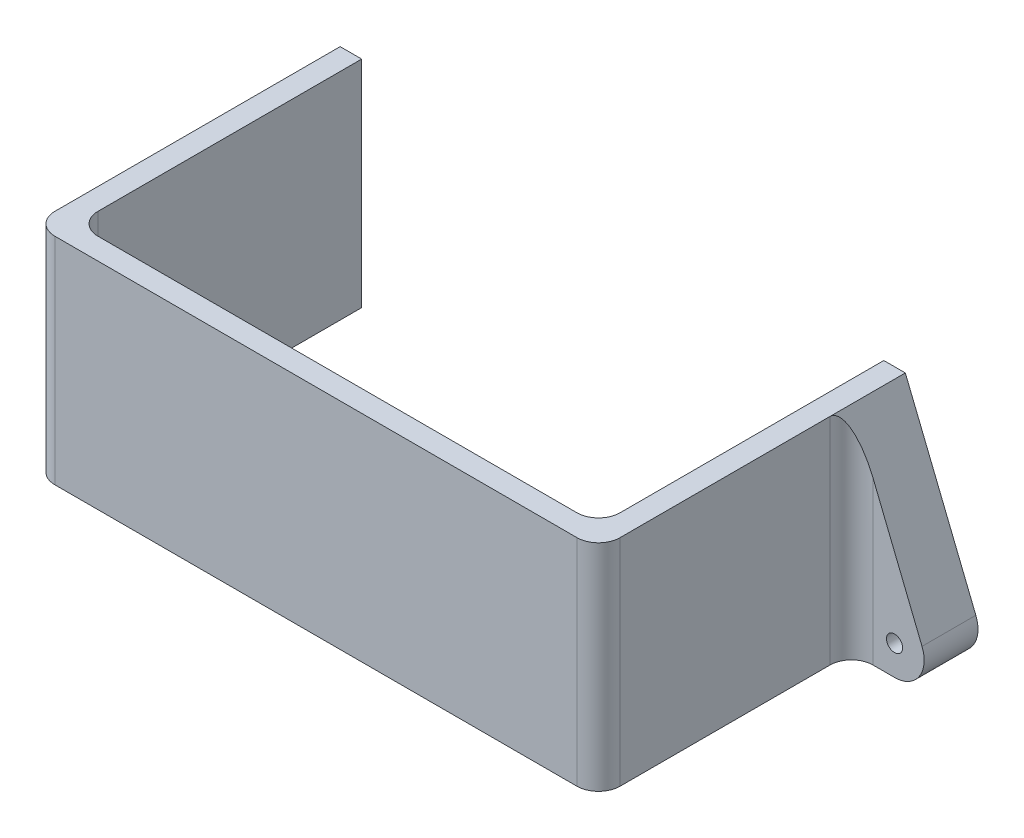
ISO-10303-21;
HEADER;
FILE_DESCRIPTION(('STEP AP214'),'2;1');
FILE_NAME('part.step','',(''),(''),'','','');
FILE_SCHEMA(('AUTOMOTIVE_DESIGN { 1 0 10303 214 1 1 1 1 }'));
ENDSEC;
DATA;
#1=APPLICATION_CONTEXT('core data for automotive mechanical design processes');
#2=APPLICATION_PROTOCOL_DEFINITION('international standard','automotive_design',2000,#1);
#3=PRODUCT_CONTEXT('',#1,'mechanical');
#4=PRODUCT('Part','Part','',(#3));
#5=PRODUCT_RELATED_PRODUCT_CATEGORY('part','',(#4));
#6=PRODUCT_DEFINITION_FORMATION('','',#4);
#7=PRODUCT_DEFINITION_CONTEXT('part definition',#1,'design');
#8=PRODUCT_DEFINITION('design','',#6,#7);
#9=PRODUCT_DEFINITION_SHAPE('','',#8);
#10=(LENGTH_UNIT() NAMED_UNIT(*) SI_UNIT(.MILLI.,.METRE.));
#11=(NAMED_UNIT(*) PLANE_ANGLE_UNIT() SI_UNIT($,.RADIAN.));
#12=(NAMED_UNIT(*) SI_UNIT($,.STERADIAN.) SOLID_ANGLE_UNIT());
#13=UNCERTAINTY_MEASURE_WITH_UNIT(LENGTH_MEASURE(1.E-05),#10,'distance_accuracy_value','');
#14=(GEOMETRIC_REPRESENTATION_CONTEXT(3) GLOBAL_UNCERTAINTY_ASSIGNED_CONTEXT((#13)) GLOBAL_UNIT_ASSIGNED_CONTEXT((#10,
#11,#12)) REPRESENTATION_CONTEXT('',''));
#15=CARTESIAN_POINT('',(0.,0.,0.));
#16=DIRECTION('',(0.,0.,1.));
#17=DIRECTION('',(1.,0.,0.));
#18=AXIS2_PLACEMENT_3D('',#15,#16,#17);
#19=CARTESIAN_POINT('',(-26.25,20.,-13.25));
#20=DIRECTION('',(0.,0.,1.));
#21=DIRECTION('',(1.,0.,0.));
#22=AXIS2_PLACEMENT_3D('',#19,#20,#21);
#23=PLANE('',#22);
#24=DIRECTION('',(-1.,0.,0.));
#25=VECTOR('',#24,1.);
#26=CARTESIAN_POINT('',(-26.25,0.,-13.25));
#27=LINE('',#26,#25);
#28=CARTESIAN_POINT('',(-24.25,0.,-13.25));
#29=VERTEX_POINT('',#28);
#30=CARTESIAN_POINT('',(-30.25,0.,-13.25));
#31=VERTEX_POINT('',#30);
#32=EDGE_CURVE('E223',#29,#31,#27,.T.);
#33=ORIENTED_EDGE('',*,*,#32,.T.);
#34=CARTESIAN_POINT('',(-30.25,2.75,-13.25));
#35=DIRECTION('',(0.,0.,1.));
#36=DIRECTION('',(-1.,0.,0.));
#37=AXIS2_PLACEMENT_3D('',#34,#35,#36);
#38=CIRCLE('',#37,2.75);
#39=CARTESIAN_POINT('',(-32.7999456776087,3.779697548431,-13.25));
#40=VERTEX_POINT('',#39);
#41=EDGE_CURVE('E190',#40,#31,#38,.T.);
#42=ORIENTED_EDGE('',*,*,#41,.F.);
#43=DIRECTION('',(-0.374435472156727,-0.927252973675884,0.));
#44=VECTOR('',#43,1.);
#45=CARTESIAN_POINT('',(-32.7999456776087,3.779697548431,-13.25));
#46=LINE('',#45,#44);
#47=CARTESIAN_POINT('',(-26.25,20.,-13.25));
#48=VERTEX_POINT('',#47);
#49=EDGE_CURVE('E181',#48,#40,#46,.T.);
#50=ORIENTED_EDGE('',*,*,#49,.F.);
#51=DIRECTION('',(-1.,0.,0.));
#52=VECTOR('',#51,1.);
#53=CARTESIAN_POINT('',(-26.25,20.,-13.25));
#54=LINE('',#53,#52);
#55=CARTESIAN_POINT('',(-24.25,20.,-13.25));
#56=VERTEX_POINT('',#55);
#57=EDGE_CURVE('E228',#56,#48,#54,.T.);
#58=ORIENTED_EDGE('',*,*,#57,.F.);
#59=DIRECTION('',(0.,-1.,0.));
#60=VECTOR('',#59,1.);
#61=CARTESIAN_POINT('',(-24.25,20.,-13.25));
#62=LINE('',#61,#60);
#63=EDGE_CURVE('E249',#56,#29,#62,.T.);
#64=ORIENTED_EDGE('',*,*,#63,.T.);
#65=EDGE_LOOP('',(#33,#42,#50,#58,#64));
#66=FACE_BOUND('',#65,.T.);
#67=CARTESIAN_POINT('',(-30.25,2.75,-13.25));
#68=DIRECTION('',(0.,0.,1.));
#69=DIRECTION('',(1.,0.,0.));
#70=AXIS2_PLACEMENT_3D('',#67,#68,#69);
#71=CIRCLE('',#70,0.750000000000002);
#72=CARTESIAN_POINT('',(-29.5,2.75,-13.25));
#73=VERTEX_POINT('',#72);
#74=EDGE_CURVE('E193',#73,#73,#71,.T.);
#75=ORIENTED_EDGE('',*,*,#74,.T.);
#76=EDGE_LOOP('',(#75));
#77=FACE_BOUND('',#76,.T.);
#78=ADVANCED_FACE('F37',(#66,#77),#23,.F.);
#79=CARTESIAN_POINT('',(-26.25,20.,-13.25));
#80=DIRECTION('',(1.,0.,0.));
#81=DIRECTION('',(0.,0.,-1.));
#82=AXIS2_PLACEMENT_3D('',#79,#80,#81);
#83=PLANE('',#82);
#84=DIRECTION('',(0.,0.,1.));
#85=VECTOR('',#84,1.);
#86=CARTESIAN_POINT('',(-26.25,20.,-13.25));
#87=LINE('',#86,#85);
#88=CARTESIAN_POINT('',(-26.25,20.,-6.25));
#89=VERTEX_POINT('',#88);
#90=CARTESIAN_POINT('',(-26.25,20.,13.25));
#91=VERTEX_POINT('',#90);
#92=EDGE_CURVE('E230',#89,#91,#87,.T.);
#93=ORIENTED_EDGE('',*,*,#92,.F.);
#94=DIRECTION('',(0.,1.,0.));
#95=VECTOR('',#94,1.);
#96=CARTESIAN_POINT('',(-26.25,20.,-6.25));
#97=LINE('',#96,#95);
#98=CARTESIAN_POINT('',(-26.25,0.,-6.25));
#99=VERTEX_POINT('',#98);
#100=EDGE_CURVE('E312',#89,#99,#97,.F.);
#101=ORIENTED_EDGE('',*,*,#100,.T.);
#102=DIRECTION('',(0.,0.,1.));
#103=VECTOR('',#102,1.);
#104=CARTESIAN_POINT('',(-26.25,0.,-13.25));
#105=LINE('',#104,#103);
#106=CARTESIAN_POINT('',(-26.25,0.,13.25));
#107=VERTEX_POINT('',#106);
#108=EDGE_CURVE('E251',#99,#107,#105,.T.);
#109=ORIENTED_EDGE('',*,*,#108,.T.);
#110=DIRECTION('',(0.,-1.,0.));
#111=VECTOR('',#110,1.);
#112=CARTESIAN_POINT('',(-26.25,20.,13.25));
#113=LINE('',#112,#111);
#114=EDGE_CURVE('E290',#107,#91,#113,.F.);
#115=ORIENTED_EDGE('',*,*,#114,.T.);
#116=EDGE_LOOP('',(#93,#101,#109,#115));
#117=FACE_BOUND('',#116,.T.);
#118=ADVANCED_FACE('F409',(#117),#83,.F.);
#119=CARTESIAN_POINT('',(-26.25,20.,15.25));
#120=DIRECTION('',(0.,0.,-1.));
#121=DIRECTION('',(-1.,0.,0.));
#122=AXIS2_PLACEMENT_3D('',#119,#120,#121);
#123=PLANE('',#122);
#124=DIRECTION('',(1.,0.,0.));
#125=VECTOR('',#124,1.);
#126=CARTESIAN_POINT('',(-26.25,0.,15.25));
#127=LINE('',#126,#125);
#128=CARTESIAN_POINT('',(-24.25,0.,15.25));
#129=VERTEX_POINT('',#128);
#130=CARTESIAN_POINT('',(24.25,0.,15.25));
#131=VERTEX_POINT('',#130);
#132=EDGE_CURVE('E253',#129,#131,#127,.T.);
#133=ORIENTED_EDGE('',*,*,#132,.T.);
#134=DIRECTION('',(0.,-1.,0.));
#135=VECTOR('',#134,1.);
#136=CARTESIAN_POINT('',(24.25,20.,15.25));
#137=LINE('',#136,#135);
#138=CARTESIAN_POINT('',(24.25,20.,15.25));
#139=VERTEX_POINT('',#138);
#140=EDGE_CURVE('E284',#131,#139,#137,.F.);
#141=ORIENTED_EDGE('',*,*,#140,.T.);
#142=DIRECTION('',(1.,0.,0.));
#143=VECTOR('',#142,1.);
#144=CARTESIAN_POINT('',(-26.25,20.,15.25));
#145=LINE('',#144,#143);
#146=CARTESIAN_POINT('',(-24.25,20.,15.25));
#147=VERTEX_POINT('',#146);
#148=EDGE_CURVE('E233',#147,#139,#145,.T.);
#149=ORIENTED_EDGE('',*,*,#148,.F.);
#150=DIRECTION('',(0.,-1.,0.));
#151=VECTOR('',#150,1.);
#152=CARTESIAN_POINT('',(-24.25,20.,15.25));
#153=LINE('',#152,#151);
#154=EDGE_CURVE('E281',#147,#129,#153,.T.);
#155=ORIENTED_EDGE('',*,*,#154,.T.);
#156=EDGE_LOOP('',(#133,#141,#149,#155));
#157=FACE_BOUND('',#156,.T.);
#158=ADVANCED_FACE('F350',(#157),#123,.F.);
#159=CARTESIAN_POINT('',(26.25,20.,-13.25));
#160=DIRECTION('',(-1.,0.,0.));
#161=DIRECTION('',(0.,0.,1.));
#162=AXIS2_PLACEMENT_3D('',#159,#160,#161);
#163=PLANE('',#162);
#164=DIRECTION('',(0.,0.,-1.));
#165=VECTOR('',#164,1.);
#166=CARTESIAN_POINT('',(26.25,0.,-13.25));
#167=LINE('',#166,#165);
#168=CARTESIAN_POINT('',(26.25,0.,13.25));
#169=VERTEX_POINT('',#168);
#170=CARTESIAN_POINT('',(26.25,0.,-6.25));
#171=VERTEX_POINT('',#170);
#172=EDGE_CURVE('E256',#169,#171,#167,.T.);
#173=ORIENTED_EDGE('',*,*,#172,.T.);
#174=DIRECTION('',(0.,1.,0.));
#175=VECTOR('',#174,1.);
#176=CARTESIAN_POINT('',(26.25,20.,-6.25));
#177=LINE('',#176,#175);
#178=CARTESIAN_POINT('',(26.25,20.,-6.25));
#179=VERTEX_POINT('',#178);
#180=EDGE_CURVE('E314',#171,#179,#177,.T.);
#181=ORIENTED_EDGE('',*,*,#180,.T.);
#182=DIRECTION('',(0.,0.,-1.));
#183=VECTOR('',#182,1.);
#184=CARTESIAN_POINT('',(26.25,20.,-13.25));
#185=LINE('',#184,#183);
#186=CARTESIAN_POINT('',(26.25,20.,13.25));
#187=VERTEX_POINT('',#186);
#188=EDGE_CURVE('E236',#187,#179,#185,.T.);
#189=ORIENTED_EDGE('',*,*,#188,.F.);
#190=DIRECTION('',(0.,-1.,0.));
#191=VECTOR('',#190,1.);
#192=CARTESIAN_POINT('',(26.25,20.,13.25));
#193=LINE('',#192,#191);
#194=EDGE_CURVE('E273',#187,#169,#193,.T.);
#195=ORIENTED_EDGE('',*,*,#194,.T.);
#196=EDGE_LOOP('',(#173,#181,#189,#195));
#197=FACE_BOUND('',#196,.T.);
#198=ADVANCED_FACE('F341',(#197),#163,.F.);
#199=CARTESIAN_POINT('',(26.25,20.,-13.25));
#200=DIRECTION('',(0.,0.,1.));
#201=DIRECTION('',(1.,0.,0.));
#202=AXIS2_PLACEMENT_3D('',#199,#200,#201);
#203=PLANE('',#202);
#204=DIRECTION('',(-1.,0.,0.));
#205=VECTOR('',#204,1.);
#206=CARTESIAN_POINT('',(26.25,0.,-13.25));
#207=LINE('',#206,#205);
#208=CARTESIAN_POINT('',(30.25,0.,-13.25));
#209=VERTEX_POINT('',#208);
#210=CARTESIAN_POINT('',(24.25,0.,-13.25));
#211=VERTEX_POINT('',#210);
#212=EDGE_CURVE('E259',#209,#211,#207,.T.);
#213=ORIENTED_EDGE('',*,*,#212,.T.);
#214=DIRECTION('',(0.,-1.,0.));
#215=VECTOR('',#214,1.);
#216=CARTESIAN_POINT('',(24.25,20.,-13.25));
#217=LINE('',#216,#215);
#218=CARTESIAN_POINT('',(24.25,20.,-13.25));
#219=VERTEX_POINT('',#218);
#220=EDGE_CURVE('E270',#219,#211,#217,.T.);
#221=ORIENTED_EDGE('',*,*,#220,.F.);
#222=DIRECTION('',(-1.,0.,0.));
#223=VECTOR('',#222,1.);
#224=CARTESIAN_POINT('',(26.25,20.,-13.25));
#225=LINE('',#224,#223);
#226=CARTESIAN_POINT('',(26.25,20.,-13.25));
#227=VERTEX_POINT('',#226);
#228=EDGE_CURVE('E239',#227,#219,#225,.T.);
#229=ORIENTED_EDGE('',*,*,#228,.F.);
#230=DIRECTION('',(0.374435472156727,-0.927252973675884,0.));
#231=VECTOR('',#230,1.);
#232=CARTESIAN_POINT('',(32.7999456776087,3.779697548431,-13.25));
#233=LINE('',#232,#231);
#234=CARTESIAN_POINT('',(32.7999456776087,3.779697548431,-13.25));
#235=VERTEX_POINT('',#234);
#236=EDGE_CURVE('E211',#227,#235,#233,.T.);
#237=ORIENTED_EDGE('',*,*,#236,.T.);
#238=CARTESIAN_POINT('',(30.25,2.75,-13.25));
#239=DIRECTION('',(0.,0.,-1.));
#240=DIRECTION('',(1.,0.,0.));
#241=AXIS2_PLACEMENT_3D('',#238,#239,#240);
#242=CIRCLE('',#241,2.75);
#243=EDGE_CURVE('E204',#235,#209,#242,.T.);
#244=ORIENTED_EDGE('',*,*,#243,.T.);
#245=EDGE_LOOP('',(#213,#221,#229,#237,#244));
#246=FACE_BOUND('',#245,.T.);
#247=CARTESIAN_POINT('',(30.25,2.75,-13.25));
#248=DIRECTION('',(0.,0.,-1.));
#249=DIRECTION('',(-1.,0.,0.));
#250=AXIS2_PLACEMENT_3D('',#247,#248,#249);
#251=CIRCLE('',#250,0.750000000000002);
#252=CARTESIAN_POINT('',(29.5,2.75,-13.25));
#253=VERTEX_POINT('',#252);
#254=EDGE_CURVE('E199',#253,#253,#251,.T.);
#255=ORIENTED_EDGE('',*,*,#254,.F.);
#256=EDGE_LOOP('',(#255));
#257=FACE_BOUND('',#256,.T.);
#258=ADVANCED_FACE('F394',(#246,#257),#203,.F.);
#259=CARTESIAN_POINT('',(24.25,20.,-13.25));
#260=DIRECTION('',(1.,0.,0.));
#261=DIRECTION('',(0.,0.,-1.));
#262=AXIS2_PLACEMENT_3D('',#259,#260,#261);
#263=PLANE('',#262);
#264=DIRECTION('',(0.,0.,1.));
#265=VECTOR('',#264,1.);
#266=CARTESIAN_POINT('',(24.25,0.,-13.25));
#267=LINE('',#266,#265);
#268=CARTESIAN_POINT('',(24.25,0.,11.25));
#269=VERTEX_POINT('',#268);
#270=EDGE_CURVE('E261',#211,#269,#267,.T.);
#271=ORIENTED_EDGE('',*,*,#270,.T.);
#272=DIRECTION('',(0.,-1.,0.));
#273=VECTOR('',#272,1.);
#274=CARTESIAN_POINT('',(24.25,20.,11.25));
#275=LINE('',#274,#273);
#276=CARTESIAN_POINT('',(24.25,20.,11.25));
#277=VERTEX_POINT('',#276);
#278=EDGE_CURVE('E301',#269,#277,#275,.F.);
#279=ORIENTED_EDGE('',*,*,#278,.T.);
#280=DIRECTION('',(0.,0.,1.));
#281=VECTOR('',#280,1.);
#282=CARTESIAN_POINT('',(24.25,20.,-13.25));
#283=LINE('',#282,#281);
#284=EDGE_CURVE('E241',#219,#277,#283,.T.);
#285=ORIENTED_EDGE('',*,*,#284,.F.);
#286=ORIENTED_EDGE('',*,*,#220,.T.);
#287=EDGE_LOOP('',(#271,#279,#285,#286));
#288=FACE_BOUND('',#287,.T.);
#289=ADVANCED_FACE('F390',(#288),#263,.F.);
#290=CARTESIAN_POINT('',(-24.25,20.,13.25));
#291=DIRECTION('',(0.,0.,1.));
#292=DIRECTION('',(1.,0.,0.));
#293=AXIS2_PLACEMENT_3D('',#290,#291,#292);
#294=PLANE('',#293);
#295=DIRECTION('',(-1.,0.,0.));
#296=VECTOR('',#295,1.);
#297=CARTESIAN_POINT('',(-24.25,0.,13.25));
#298=LINE('',#297,#296);
#299=CARTESIAN_POINT('',(22.25,0.,13.25));
#300=VERTEX_POINT('',#299);
#301=CARTESIAN_POINT('',(-22.25,0.,13.25));
#302=VERTEX_POINT('',#301);
#303=EDGE_CURVE('E264',#300,#302,#298,.T.);
#304=ORIENTED_EDGE('',*,*,#303,.T.);
#305=DIRECTION('',(0.,-1.,0.));
#306=VECTOR('',#305,1.);
#307=CARTESIAN_POINT('',(-22.25,20.,13.25));
#308=LINE('',#307,#306);
#309=CARTESIAN_POINT('',(-22.25,20.,13.25));
#310=VERTEX_POINT('',#309);
#311=EDGE_CURVE('E299',#302,#310,#308,.F.);
#312=ORIENTED_EDGE('',*,*,#311,.T.);
#313=DIRECTION('',(-1.,0.,0.));
#314=VECTOR('',#313,1.);
#315=CARTESIAN_POINT('',(-24.25,20.,13.25));
#316=LINE('',#315,#314);
#317=CARTESIAN_POINT('',(22.25,20.,13.25));
#318=VERTEX_POINT('',#317);
#319=EDGE_CURVE('E244',#318,#310,#316,.T.);
#320=ORIENTED_EDGE('',*,*,#319,.F.);
#321=DIRECTION('',(0.,-1.,0.));
#322=VECTOR('',#321,1.);
#323=CARTESIAN_POINT('',(22.25,0.,13.25));
#324=LINE('',#323,#322);
#325=EDGE_CURVE('E296',#318,#300,#324,.T.);
#326=ORIENTED_EDGE('',*,*,#325,.T.);
#327=EDGE_LOOP('',(#304,#312,#320,#326));
#328=FACE_BOUND('',#327,.T.);
#329=ADVANCED_FACE('F380',(#328),#294,.F.);
#330=CARTESIAN_POINT('',(-24.25,20.,-13.25));
#331=DIRECTION('',(-1.,0.,0.));
#332=DIRECTION('',(0.,0.,1.));
#333=AXIS2_PLACEMENT_3D('',#330,#331,#332);
#334=PLANE('',#333);
#335=DIRECTION('',(0.,0.,-1.));
#336=VECTOR('',#335,1.);
#337=CARTESIAN_POINT('',(-24.25,20.,-13.25));
#338=LINE('',#337,#336);
#339=CARTESIAN_POINT('',(-24.25,20.,11.25));
#340=VERTEX_POINT('',#339);
#341=EDGE_CURVE('E247',#340,#56,#338,.T.);
#342=ORIENTED_EDGE('',*,*,#341,.F.);
#343=DIRECTION('',(0.,-1.,0.));
#344=VECTOR('',#343,1.);
#345=CARTESIAN_POINT('',(-24.25,0.,11.25));
#346=LINE('',#345,#344);
#347=CARTESIAN_POINT('',(-24.25,0.,11.25));
#348=VERTEX_POINT('',#347);
#349=EDGE_CURVE('E293',#340,#348,#346,.T.);
#350=ORIENTED_EDGE('',*,*,#349,.T.);
#351=DIRECTION('',(0.,0.,-1.));
#352=VECTOR('',#351,1.);
#353=CARTESIAN_POINT('',(-24.25,0.,-13.25));
#354=LINE('',#353,#352);
#355=EDGE_CURVE('E231',#348,#29,#354,.T.);
#356=ORIENTED_EDGE('',*,*,#355,.T.);
#357=ORIENTED_EDGE('',*,*,#63,.F.);
#358=EDGE_LOOP('',(#342,#350,#356,#357));
#359=FACE_BOUND('',#358,.T.);
#360=ADVANCED_FACE('F372',(#359),#334,.F.);
#361=CARTESIAN_POINT('',(0.,20.,0.));
#362=DIRECTION('',(0.,-1.,0.));
#363=DIRECTION('',(0.,0.,-1.));
#364=AXIS2_PLACEMENT_3D('',#361,#362,#363);
#365=PLANE('',#364);
#366=ORIENTED_EDGE('',*,*,#148,.T.);
#367=CARTESIAN_POINT('',(24.25,20.,13.25));
#368=DIRECTION('',(0.,-1.,0.));
#369=DIRECTION('',(0.,0.,-1.));
#370=AXIS2_PLACEMENT_3D('',#367,#368,#369);
#371=CIRCLE('',#370,2.);
#372=EDGE_CURVE('E288',#139,#187,#371,.F.);
#373=ORIENTED_EDGE('',*,*,#372,.T.);
#374=ORIENTED_EDGE('',*,*,#188,.T.);
#375=DIRECTION('',(0.,0.,-1.));
#376=VECTOR('',#375,1.);
#377=CARTESIAN_POINT('',(26.25,20.,-8.25));
#378=LINE('',#377,#376);
#379=EDGE_CURVE('E224',#179,#227,#378,.T.);
#380=ORIENTED_EDGE('',*,*,#379,.T.);
#381=ORIENTED_EDGE('',*,*,#228,.T.);
#382=ORIENTED_EDGE('',*,*,#284,.T.);
#383=CARTESIAN_POINT('',(22.25,20.,11.25));
#384=DIRECTION('',(0.,-1.,0.));
#385=DIRECTION('',(0.,0.,-1.));
#386=AXIS2_PLACEMENT_3D('',#383,#384,#385);
#387=CIRCLE('',#386,2.);
#388=EDGE_CURVE('E309',#277,#318,#387,.T.);
#389=ORIENTED_EDGE('',*,*,#388,.T.);
#390=ORIENTED_EDGE('',*,*,#319,.T.);
#391=CARTESIAN_POINT('',(-22.25,20.,11.25));
#392=DIRECTION('',(0.,-1.,0.));
#393=DIRECTION('',(0.,0.,-1.));
#394=AXIS2_PLACEMENT_3D('',#391,#392,#393);
#395=CIRCLE('',#394,2.);
#396=EDGE_CURVE('E305',#310,#340,#395,.T.);
#397=ORIENTED_EDGE('',*,*,#396,.T.);
#398=ORIENTED_EDGE('',*,*,#341,.T.);
#399=ORIENTED_EDGE('',*,*,#57,.T.);
#400=EDGE_CURVE('E53',#48,#89,#87,.T.);
#401=ORIENTED_EDGE('',*,*,#400,.T.);
#402=ORIENTED_EDGE('',*,*,#92,.T.);
#403=CARTESIAN_POINT('',(-24.25,20.,13.25));
#404=DIRECTION('',(0.,-1.,0.));
#405=DIRECTION('',(0.,0.,-1.));
#406=AXIS2_PLACEMENT_3D('',#403,#404,#405);
#407=CIRCLE('',#406,2.);
#408=EDGE_CURVE('E286',#91,#147,#407,.F.);
#409=ORIENTED_EDGE('',*,*,#408,.T.);
#410=EDGE_LOOP('',(#366,#373,#374,#380,#381,#382,#389,#390,#397,#398,#399,#401,#402,#409));
#411=FACE_BOUND('',#410,.T.);
#412=ADVANCED_FACE('F382',(#411),#365,.F.);
#413=CARTESIAN_POINT('',(0.,0.,0.));
#414=DIRECTION('',(0.,-1.,0.));
#415=DIRECTION('',(0.,0.,-1.));
#416=AXIS2_PLACEMENT_3D('',#413,#414,#415);
#417=PLANE('',#416);
#418=ORIENTED_EDGE('',*,*,#172,.F.);
#419=CARTESIAN_POINT('',(24.25,0.,13.25));
#420=DIRECTION('',(0.,-1.,0.));
#421=DIRECTION('',(0.,0.,-1.));
#422=AXIS2_PLACEMENT_3D('',#419,#420,#421);
#423=CIRCLE('',#422,2.);
#424=EDGE_CURVE('E279',#169,#131,#423,.T.);
#425=ORIENTED_EDGE('',*,*,#424,.T.);
#426=ORIENTED_EDGE('',*,*,#132,.F.);
#427=CARTESIAN_POINT('',(-24.25,0.,13.25));
#428=DIRECTION('',(0.,-1.,0.));
#429=DIRECTION('',(0.,0.,-1.));
#430=AXIS2_PLACEMENT_3D('',#427,#428,#429);
#431=CIRCLE('',#430,2.);
#432=EDGE_CURVE('E276',#129,#107,#431,.T.);
#433=ORIENTED_EDGE('',*,*,#432,.T.);
#434=ORIENTED_EDGE('',*,*,#108,.F.);
#435=CARTESIAN_POINT('',(-28.25,0.,-6.25));
#436=DIRECTION('',(0.,-1.,0.));
#437=DIRECTION('',(0.,0.,-1.));
#438=AXIS2_PLACEMENT_3D('',#435,#436,#437);
#439=CIRCLE('',#438,2.);
#440=CARTESIAN_POINT('',(-28.25,0.,-8.25));
#441=VERTEX_POINT('',#440);
#442=EDGE_CURVE('E321',#99,#441,#439,.F.);
#443=ORIENTED_EDGE('',*,*,#442,.T.);
#444=DIRECTION('',(1.,0.,0.));
#445=VECTOR('',#444,1.);
#446=CARTESIAN_POINT('',(-26.25,0.,-8.25));
#447=LINE('',#446,#445);
#448=CARTESIAN_POINT('',(-30.25,0.,-8.25));
#449=VERTEX_POINT('',#448);
#450=EDGE_CURVE('E175',#449,#441,#447,.T.);
#451=ORIENTED_EDGE('',*,*,#450,.F.);
#452=DIRECTION('',(0.,0.,-1.));
#453=VECTOR('',#452,1.);
#454=CARTESIAN_POINT('',(-30.25,0.,-8.25));
#455=LINE('',#454,#453);
#456=EDGE_CURVE('E185',#449,#31,#455,.T.);
#457=ORIENTED_EDGE('',*,*,#456,.T.);
#458=ORIENTED_EDGE('',*,*,#32,.F.);
#459=ORIENTED_EDGE('',*,*,#355,.F.);
#460=CARTESIAN_POINT('',(-22.25,0.,11.25));
#461=DIRECTION('',(0.,-1.,0.));
#462=DIRECTION('',(0.,0.,-1.));
#463=AXIS2_PLACEMENT_3D('',#460,#461,#462);
#464=CIRCLE('',#463,2.);
#465=EDGE_CURVE('E303',#348,#302,#464,.F.);
#466=ORIENTED_EDGE('',*,*,#465,.T.);
#467=ORIENTED_EDGE('',*,*,#303,.F.);
#468=CARTESIAN_POINT('',(22.25,0.,11.25));
#469=DIRECTION('',(0.,-1.,0.));
#470=DIRECTION('',(0.,0.,-1.));
#471=AXIS2_PLACEMENT_3D('',#468,#469,#470);
#472=CIRCLE('',#471,2.);
#473=EDGE_CURVE('E307',#300,#269,#472,.F.);
#474=ORIENTED_EDGE('',*,*,#473,.T.);
#475=ORIENTED_EDGE('',*,*,#270,.F.);
#476=ORIENTED_EDGE('',*,*,#212,.F.);
#477=DIRECTION('',(0.,0.,-1.));
#478=VECTOR('',#477,1.);
#479=CARTESIAN_POINT('',(30.25,0.,-8.25));
#480=LINE('',#479,#478);
#481=CARTESIAN_POINT('',(30.25,0.,-8.25));
#482=VERTEX_POINT('',#481);
#483=EDGE_CURVE('E216',#482,#209,#480,.T.);
#484=ORIENTED_EDGE('',*,*,#483,.F.);
#485=DIRECTION('',(-1.,0.,0.));
#486=VECTOR('',#485,1.);
#487=CARTESIAN_POINT('',(26.25,0.,-8.25));
#488=LINE('',#487,#486);
#489=CARTESIAN_POINT('',(28.25,0.,-8.25));
#490=VERTEX_POINT('',#489);
#491=EDGE_CURVE('E210',#482,#490,#488,.T.);
#492=ORIENTED_EDGE('',*,*,#491,.T.);
#493=CARTESIAN_POINT('',(28.25,0.,-6.25));
#494=DIRECTION('',(0.,-1.,0.));
#495=DIRECTION('',(0.,0.,-1.));
#496=AXIS2_PLACEMENT_3D('',#493,#494,#495);
#497=CIRCLE('',#496,2.);
#498=EDGE_CURVE('E11',#490,#171,#497,.F.);
#499=ORIENTED_EDGE('',*,*,#498,.T.);
#500=EDGE_LOOP('',(#418,#425,#426,#433,#434,#443,#451,#457,#458,#459,#466,#467,#474,#475,#476,
#484,#492,#499));
#501=FACE_BOUND('',#500,.T.);
#502=ADVANCED_FACE('F339',(#501),#417,.T.);
#503=CARTESIAN_POINT('',(24.25,20.,13.25));
#504=DIRECTION('',(0.,-1.,0.));
#505=DIRECTION('',(0.,0.,-1.));
#506=AXIS2_PLACEMENT_3D('',#503,#504,#505);
#507=CYLINDRICAL_SURFACE('',#506,2.);
#508=ORIENTED_EDGE('',*,*,#372,.F.);
#509=ORIENTED_EDGE('',*,*,#140,.F.);
#510=ORIENTED_EDGE('',*,*,#424,.F.);
#511=ORIENTED_EDGE('',*,*,#194,.F.);
#512=EDGE_LOOP('',(#508,#509,#510,#511));
#513=FACE_BOUND('',#512,.T.);
#514=ADVANCED_FACE('F346',(#513),#507,.T.);
#515=CARTESIAN_POINT('',(-24.25,20.,13.25));
#516=DIRECTION('',(0.,-1.,0.));
#517=DIRECTION('',(0.,0.,-1.));
#518=AXIS2_PLACEMENT_3D('',#515,#516,#517);
#519=CYLINDRICAL_SURFACE('',#518,2.);
#520=ORIENTED_EDGE('',*,*,#408,.F.);
#521=ORIENTED_EDGE('',*,*,#114,.F.);
#522=ORIENTED_EDGE('',*,*,#432,.F.);
#523=ORIENTED_EDGE('',*,*,#154,.F.);
#524=EDGE_LOOP('',(#520,#521,#522,#523));
#525=FACE_BOUND('',#524,.T.);
#526=ADVANCED_FACE('F355',(#525),#519,.T.);
#527=CARTESIAN_POINT('',(-22.25,20.,11.25));
#528=DIRECTION('',(0.,1.,0.));
#529=DIRECTION('',(0.,0.,1.));
#530=AXIS2_PLACEMENT_3D('',#527,#528,#529);
#531=CYLINDRICAL_SURFACE('',#530,2.);
#532=ORIENTED_EDGE('',*,*,#396,.F.);
#533=ORIENTED_EDGE('',*,*,#311,.F.);
#534=ORIENTED_EDGE('',*,*,#465,.F.);
#535=ORIENTED_EDGE('',*,*,#349,.F.);
#536=EDGE_LOOP('',(#532,#533,#534,#535));
#537=FACE_BOUND('',#536,.T.);
#538=ADVANCED_FACE('F376',(#537),#531,.F.);
#539=CARTESIAN_POINT('',(22.25,20.,11.25));
#540=DIRECTION('',(0.,1.,0.));
#541=DIRECTION('',(0.,0.,1.));
#542=AXIS2_PLACEMENT_3D('',#539,#540,#541);
#543=CYLINDRICAL_SURFACE('',#542,2.);
#544=ORIENTED_EDGE('',*,*,#388,.F.);
#545=ORIENTED_EDGE('',*,*,#278,.F.);
#546=ORIENTED_EDGE('',*,*,#473,.F.);
#547=ORIENTED_EDGE('',*,*,#325,.F.);
#548=EDGE_LOOP('',(#544,#545,#546,#547));
#549=FACE_BOUND('',#548,.T.);
#550=ADVANCED_FACE('F387',(#549),#543,.F.);
#551=CARTESIAN_POINT('',(30.25,2.75,-8.25));
#552=DIRECTION('',(0.,0.,-1.));
#553=DIRECTION('',(-1.,0.,0.));
#554=AXIS2_PLACEMENT_3D('',#551,#552,#553);
#555=CYLINDRICAL_SURFACE('',#554,2.75);
#556=ORIENTED_EDGE('',*,*,#243,.F.);
#557=DIRECTION('',(0.,0.,-1.));
#558=VECTOR('',#557,1.);
#559=CARTESIAN_POINT('',(32.7999456776087,3.779697548431,-8.25));
#560=LINE('',#559,#558);
#561=CARTESIAN_POINT('',(32.7999456776087,3.779697548431,-8.25));
#562=VERTEX_POINT('',#561);
#563=EDGE_CURVE('E221',#562,#235,#560,.T.);
#564=ORIENTED_EDGE('',*,*,#563,.F.);
#565=CARTESIAN_POINT('',(30.25,2.75,-8.25));
#566=DIRECTION('',(0.,0.,-1.));
#567=DIRECTION('',(1.,0.,0.));
#568=AXIS2_PLACEMENT_3D('',#565,#566,#567);
#569=CIRCLE('',#568,2.75);
#570=EDGE_CURVE('E207',#562,#482,#569,.T.);
#571=ORIENTED_EDGE('',*,*,#570,.T.);
#572=ORIENTED_EDGE('',*,*,#483,.T.);
#573=EDGE_LOOP('',(#556,#564,#571,#572));
#574=FACE_BOUND('',#573,.T.);
#575=ADVANCED_FACE('F398',(#574),#555,.T.);
#576=CARTESIAN_POINT('',(32.7999456776087,3.779697548431,-8.25));
#577=DIRECTION('',(0.927252973675884,0.374435472156727,0.));
#578=DIRECTION('',(-0.374435472156727,0.927252973675884,0.));
#579=AXIS2_PLACEMENT_3D('',#576,#577,#578);
#580=PLANE('',#579);
#581=ORIENTED_EDGE('',*,*,#236,.F.);
#582=ORIENTED_EDGE('',*,*,#379,.F.);
#583=CARTESIAN_POINT('',(28.25,15.0471948165864,-6.25));
#584=DIRECTION('',(0.927252973675884,0.374435472156727,0.));
#585=DIRECTION('',(-0.374435472156727,0.927252973675884,0.));
#586=AXIS2_PLACEMENT_3D('',#583,#584,#585);
#587=ELLIPSE('',#586,5.34137427867108,2.);
#588=CARTESIAN_POINT('',(28.25,15.0471948165864,-8.25));
#589=VERTEX_POINT('',#588);
#590=EDGE_CURVE('E46',#179,#589,#587,.F.);
#591=ORIENTED_EDGE('',*,*,#590,.T.);
#592=DIRECTION('',(0.374435472156727,-0.927252973675884,0.));
#593=VECTOR('',#592,1.);
#594=CARTESIAN_POINT('',(32.7999456776087,3.779697548431,-8.25));
#595=LINE('',#594,#593);
#596=EDGE_CURVE('E214',#589,#562,#595,.T.);
#597=ORIENTED_EDGE('',*,*,#596,.T.);
#598=ORIENTED_EDGE('',*,*,#563,.T.);
#599=EDGE_LOOP('',(#581,#582,#591,#597,#598));
#600=FACE_BOUND('',#599,.T.);
#601=ADVANCED_FACE('F327',(#600),#580,.T.);
#602=CARTESIAN_POINT('',(30.25,2.75,-8.25));
#603=DIRECTION('',(0.,0.,1.));
#604=DIRECTION('',(1.,0.,0.));
#605=AXIS2_PLACEMENT_3D('',#602,#603,#604);
#606=PLANE('',#605);
#607=CARTESIAN_POINT('',(30.25,2.75,-8.25));
#608=DIRECTION('',(0.,0.,-1.));
#609=DIRECTION('',(-1.,0.,0.));
#610=AXIS2_PLACEMENT_3D('',#607,#608,#609);
#611=CIRCLE('',#610,0.750000000000002);
#612=CARTESIAN_POINT('',(29.5,2.75,-8.25));
#613=VERTEX_POINT('',#612);
#614=EDGE_CURVE('E201',#613,#613,#611,.T.);
#615=ORIENTED_EDGE('',*,*,#614,.T.);
#616=EDGE_LOOP('',(#615));
#617=FACE_BOUND('',#616,.T.);
#618=ORIENTED_EDGE('',*,*,#596,.F.);
#619=DIRECTION('',(0.,1.,0.));
#620=VECTOR('',#619,1.);
#621=CARTESIAN_POINT('',(28.25,2.75,-8.25));
#622=LINE('',#621,#620);
#623=EDGE_CURVE('E317',#589,#490,#622,.F.);
#624=ORIENTED_EDGE('',*,*,#623,.T.);
#625=ORIENTED_EDGE('',*,*,#491,.F.);
#626=ORIENTED_EDGE('',*,*,#570,.F.);
#627=EDGE_LOOP('',(#618,#624,#625,#626));
#628=FACE_BOUND('',#627,.T.);
#629=ADVANCED_FACE('F334',(#617,#628),#606,.T.);
#630=CARTESIAN_POINT('',(30.25,2.75,-8.25));
#631=DIRECTION('',(0.,0.,-1.));
#632=DIRECTION('',(-1.,0.,0.));
#633=AXIS2_PLACEMENT_3D('',#630,#631,#632);
#634=CYLINDRICAL_SURFACE('',#633,0.750000000000002);
#635=ORIENTED_EDGE('',*,*,#614,.F.);
#636=EDGE_LOOP('',(#635));
#637=FACE_BOUND('',#636,.T.);
#638=ORIENTED_EDGE('',*,*,#254,.T.);
#639=EDGE_LOOP('',(#638));
#640=FACE_BOUND('',#639,.T.);
#641=ADVANCED_FACE('F438',(#637,#640),#634,.F.);
#642=CARTESIAN_POINT('',(-30.25,2.75,-8.25));
#643=DIRECTION('',(0.,0.,1.));
#644=DIRECTION('',(-1.,0.,0.));
#645=AXIS2_PLACEMENT_3D('',#642,#643,#644);
#646=PLANE('',#645);
#647=ORIENTED_EDGE('',*,*,#450,.T.);
#648=DIRECTION('',(0.,1.,0.));
#649=VECTOR('',#648,1.);
#650=CARTESIAN_POINT('',(-28.25,2.75,-8.25));
#651=LINE('',#650,#649);
#652=CARTESIAN_POINT('',(-28.25,15.0471948165864,-8.25));
#653=VERTEX_POINT('',#652);
#654=EDGE_CURVE('E172',#441,#653,#651,.T.);
#655=ORIENTED_EDGE('',*,*,#654,.T.);
#656=DIRECTION('',(-0.374435472156727,-0.927252973675884,0.));
#657=VECTOR('',#656,1.);
#658=CARTESIAN_POINT('',(-32.7999456776087,3.779697548431,-8.25));
#659=LINE('',#658,#657);
#660=CARTESIAN_POINT('',(-32.7999456776087,3.779697548431,-8.25));
#661=VERTEX_POINT('',#660);
#662=EDGE_CURVE('E163',#653,#661,#659,.T.);
#663=ORIENTED_EDGE('',*,*,#662,.T.);
#664=CARTESIAN_POINT('',(-30.25,2.75,-8.25));
#665=DIRECTION('',(0.,0.,1.));
#666=DIRECTION('',(-1.,0.,0.));
#667=AXIS2_PLACEMENT_3D('',#664,#665,#666);
#668=CIRCLE('',#667,2.75);
#669=EDGE_CURVE('E169',#661,#449,#668,.T.);
#670=ORIENTED_EDGE('',*,*,#669,.T.);
#671=EDGE_LOOP('',(#647,#655,#663,#670));
#672=FACE_BOUND('',#671,.T.);
#673=CARTESIAN_POINT('',(-30.25,2.75,-8.25));
#674=DIRECTION('',(0.,0.,1.));
#675=DIRECTION('',(1.,0.,0.));
#676=AXIS2_PLACEMENT_3D('',#673,#674,#675);
#677=CIRCLE('',#676,0.750000000000002);
#678=CARTESIAN_POINT('',(-29.5,2.75,-8.25));
#679=VERTEX_POINT('',#678);
#680=EDGE_CURVE('E197',#679,#679,#677,.T.);
#681=ORIENTED_EDGE('',*,*,#680,.F.);
#682=EDGE_LOOP('',(#681));
#683=FACE_BOUND('',#682,.T.);
#684=ADVANCED_FACE('F166',(#672,#683),#646,.T.);
#685=CARTESIAN_POINT('',(-30.25,2.75,-8.25));
#686=DIRECTION('',(0.,0.,-1.));
#687=DIRECTION('',(-1.,0.,0.));
#688=AXIS2_PLACEMENT_3D('',#685,#686,#687);
#689=CYLINDRICAL_SURFACE('',#688,2.75);
#690=ORIENTED_EDGE('',*,*,#41,.T.);
#691=ORIENTED_EDGE('',*,*,#456,.F.);
#692=ORIENTED_EDGE('',*,*,#669,.F.);
#693=DIRECTION('',(0.,0.,-1.));
#694=VECTOR('',#693,1.);
#695=CARTESIAN_POINT('',(-32.7999456776087,3.779697548431,-8.25));
#696=LINE('',#695,#694);
#697=EDGE_CURVE('E178',#661,#40,#696,.T.);
#698=ORIENTED_EDGE('',*,*,#697,.T.);
#699=EDGE_LOOP('',(#690,#691,#692,#698));
#700=FACE_BOUND('',#699,.T.);
#701=ADVANCED_FACE('F187',(#700),#689,.T.);
#702=CARTESIAN_POINT('',(-32.7999456776087,3.779697548431,-8.25));
#703=DIRECTION('',(0.927252973675884,-0.374435472156727,0.));
#704=DIRECTION('',(0.374435472156727,0.927252973675884,0.));
#705=AXIS2_PLACEMENT_3D('',#702,#703,#704);
#706=PLANE('',#705);
#707=ORIENTED_EDGE('',*,*,#49,.T.);
#708=ORIENTED_EDGE('',*,*,#697,.F.);
#709=ORIENTED_EDGE('',*,*,#662,.F.);
#710=CARTESIAN_POINT('',(-28.25,15.0471948165864,-6.25));
#711=DIRECTION('',(0.927252973675884,-0.374435472156727,0.));
#712=DIRECTION('',(0.374435472156727,0.927252973675884,0.));
#713=AXIS2_PLACEMENT_3D('',#710,#711,#712);
#714=ELLIPSE('',#713,5.34137427867108,2.);
#715=EDGE_CURVE('E319',#653,#89,#714,.T.);
#716=ORIENTED_EDGE('',*,*,#715,.T.);
#717=ORIENTED_EDGE('',*,*,#400,.F.);
#718=EDGE_LOOP('',(#707,#708,#709,#716,#717));
#719=FACE_BOUND('',#718,.T.);
#720=ADVANCED_FACE('F179',(#719),#706,.F.);
#721=CARTESIAN_POINT('',(-30.25,2.75,-8.25));
#722=DIRECTION('',(0.,0.,-1.));
#723=DIRECTION('',(-1.,0.,0.));
#724=AXIS2_PLACEMENT_3D('',#721,#722,#723);
#725=CYLINDRICAL_SURFACE('',#724,0.750000000000002);
#726=ORIENTED_EDGE('',*,*,#680,.T.);
#727=EDGE_LOOP('',(#726));
#728=FACE_BOUND('',#727,.T.);
#729=ORIENTED_EDGE('',*,*,#74,.F.);
#730=EDGE_LOOP('',(#729));
#731=FACE_BOUND('',#730,.T.);
#732=ADVANCED_FACE('F423',(#728,#731),#725,.F.);
#733=CARTESIAN_POINT('',(-28.25,2.75,-6.25));
#734=DIRECTION('',(0.,1.,0.));
#735=DIRECTION('',(0.,0.,1.));
#736=AXIS2_PLACEMENT_3D('',#733,#734,#735);
#737=CYLINDRICAL_SURFACE('',#736,2.);
#738=ORIENTED_EDGE('',*,*,#442,.F.);
#739=ORIENTED_EDGE('',*,*,#100,.F.);
#740=ORIENTED_EDGE('',*,*,#715,.F.);
#741=ORIENTED_EDGE('',*,*,#654,.F.);
#742=EDGE_LOOP('',(#738,#739,#740,#741));
#743=FACE_BOUND('',#742,.T.);
#744=ADVANCED_FACE('F362',(#743),#737,.F.);
#745=CARTESIAN_POINT('',(28.25,20.,-6.25));
#746=DIRECTION('',(0.,1.,0.));
#747=DIRECTION('',(0.,0.,1.));
#748=AXIS2_PLACEMENT_3D('',#745,#746,#747);
#749=CYLINDRICAL_SURFACE('',#748,2.);
#750=ORIENTED_EDGE('',*,*,#498,.F.);
#751=ORIENTED_EDGE('',*,*,#623,.F.);
#752=ORIENTED_EDGE('',*,*,#590,.F.);
#753=ORIENTED_EDGE('',*,*,#180,.F.);
#754=EDGE_LOOP('',(#750,#751,#752,#753));
#755=FACE_BOUND('',#754,.T.);
#756=ADVANCED_FACE('F39',(#755),#749,.F.);
#757=CLOSED_SHELL('',(#78,#118,#158,#198,#258,#289,#329,#360,#412,#502,#514,#526,#538,#550,#575,
#601,#629,#641,#684,#701,#720,#732,#744,#756));
#758=MANIFOLD_SOLID_BREP('B2',#757);
#759=ADVANCED_BREP_SHAPE_REPRESENTATION('',(#18,#758),#14);
#760=SHAPE_DEFINITION_REPRESENTATION(#9,#759);
ENDSEC;
END-ISO-10303-21;
